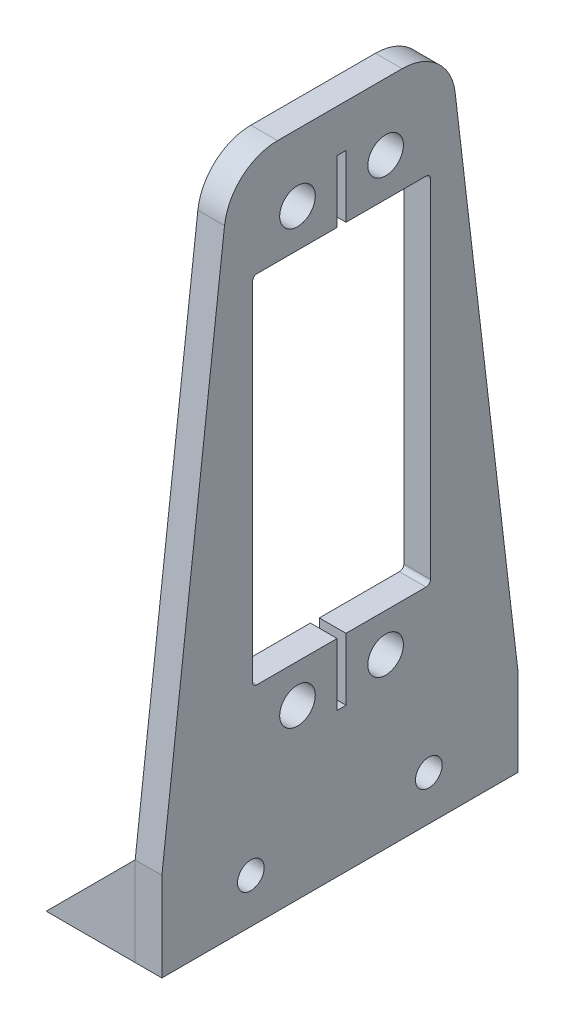
ISO-10303-21;
HEADER;
FILE_DESCRIPTION(('STEP AP214'),'2;1');
FILE_NAME('part.step','',(''),(''),'','','');
FILE_SCHEMA(('AUTOMOTIVE_DESIGN { 1 0 10303 214 1 1 1 1 }'));
ENDSEC;
DATA;
#1=APPLICATION_CONTEXT('core data for automotive mechanical design processes');
#2=APPLICATION_PROTOCOL_DEFINITION('international standard','automotive_design',2000,#1);
#3=PRODUCT_CONTEXT('',#1,'mechanical');
#4=PRODUCT('Part','Part','',(#3));
#5=PRODUCT_RELATED_PRODUCT_CATEGORY('part','',(#4));
#6=PRODUCT_DEFINITION_FORMATION('','',#4);
#7=PRODUCT_DEFINITION_CONTEXT('part definition',#1,'design');
#8=PRODUCT_DEFINITION('design','',#6,#7);
#9=PRODUCT_DEFINITION_SHAPE('','',#8);
#10=(LENGTH_UNIT() NAMED_UNIT(*) SI_UNIT(.MILLI.,.METRE.));
#11=(NAMED_UNIT(*) PLANE_ANGLE_UNIT() SI_UNIT($,.RADIAN.));
#12=(NAMED_UNIT(*) SI_UNIT($,.STERADIAN.) SOLID_ANGLE_UNIT());
#13=UNCERTAINTY_MEASURE_WITH_UNIT(LENGTH_MEASURE(1.E-05),#10,'distance_accuracy_value','');
#14=(GEOMETRIC_REPRESENTATION_CONTEXT(3) GLOBAL_UNCERTAINTY_ASSIGNED_CONTEXT((#13)) GLOBAL_UNIT_ASSIGNED_CONTEXT((#10,
#11,#12)) REPRESENTATION_CONTEXT('',''));
#15=CARTESIAN_POINT('',(0.,0.,0.));
#16=DIRECTION('',(0.,0.,1.));
#17=DIRECTION('',(1.,0.,0.));
#18=AXIS2_PLACEMENT_3D('',#15,#16,#17);
#19=CARTESIAN_POINT('',(23.,0.,20.));
#20=DIRECTION('',(0.,1.,0.));
#21=DIRECTION('',(0.,0.,1.));
#22=AXIS2_PLACEMENT_3D('',#19,#20,#21);
#23=PLANE('',#22);
#24=DIRECTION('',(0.,0.,-1.));
#25=VECTOR('',#24,1.);
#26=CARTESIAN_POINT('',(20.,0.,20.));
#27=LINE('',#26,#25);
#28=CARTESIAN_POINT('',(20.,0.,20.));
#29=VERTEX_POINT('',#28);
#30=CARTESIAN_POINT('',(20.,0.,-20.));
#31=VERTEX_POINT('',#30);
#32=EDGE_CURVE('E298',#29,#31,#27,.T.);
#33=ORIENTED_EDGE('',*,*,#32,.T.);
#34=DIRECTION('',(-1.,0.,0.));
#35=VECTOR('',#34,1.);
#36=CARTESIAN_POINT('',(23.,0.,-20.));
#37=LINE('',#36,#35);
#38=CARTESIAN_POINT('',(23.,0.,-20.));
#39=VERTEX_POINT('',#38);
#40=EDGE_CURVE('E12',#39,#31,#37,.T.);
#41=ORIENTED_EDGE('',*,*,#40,.F.);
#42=DIRECTION('',(0.,0.,-1.));
#43=VECTOR('',#42,1.);
#44=CARTESIAN_POINT('',(23.,0.,20.));
#45=LINE('',#44,#43);
#46=CARTESIAN_POINT('',(23.,0.,20.));
#47=VERTEX_POINT('',#46);
#48=EDGE_CURVE('E299',#47,#39,#45,.T.);
#49=ORIENTED_EDGE('',*,*,#48,.F.);
#50=DIRECTION('',(-1.,0.,0.));
#51=VECTOR('',#50,1.);
#52=CARTESIAN_POINT('',(23.,0.,20.));
#53=LINE('',#52,#51);
#54=EDGE_CURVE('E317',#47,#29,#53,.T.);
#55=ORIENTED_EDGE('',*,*,#54,.T.);
#56=EDGE_LOOP('',(#33,#41,#49,#55));
#57=FACE_BOUND('',#56,.T.);
#58=ADVANCED_FACE('F51',(#57),#23,.F.);
#59=CARTESIAN_POINT('',(23.,0.,-20.));
#60=DIRECTION('',(0.,0.,1.));
#61=DIRECTION('',(1.,0.,0.));
#62=AXIS2_PLACEMENT_3D('',#59,#60,#61);
#63=PLANE('',#62);
#64=DIRECTION('',(0.,1.,0.));
#65=VECTOR('',#64,1.);
#66=CARTESIAN_POINT('',(20.,0.,-20.));
#67=LINE('',#66,#65);
#68=CARTESIAN_POINT('',(20.,10.,-20.));
#69=VERTEX_POINT('',#68);
#70=EDGE_CURVE('E320',#31,#69,#67,.T.);
#71=ORIENTED_EDGE('',*,*,#70,.T.);
#72=DIRECTION('',(-1.,0.,0.));
#73=VECTOR('',#72,1.);
#74=CARTESIAN_POINT('',(23.,10.,-20.));
#75=LINE('',#74,#73);
#76=CARTESIAN_POINT('',(23.,10.,-20.));
#77=VERTEX_POINT('',#76);
#78=EDGE_CURVE('E58',#77,#69,#75,.T.);
#79=ORIENTED_EDGE('',*,*,#78,.F.);
#80=DIRECTION('',(0.,1.,0.));
#81=VECTOR('',#80,1.);
#82=CARTESIAN_POINT('',(23.,0.,-20.));
#83=LINE('',#82,#81);
#84=EDGE_CURVE('E302',#39,#77,#83,.T.);
#85=ORIENTED_EDGE('',*,*,#84,.F.);
#86=ORIENTED_EDGE('',*,*,#40,.T.);
#87=EDGE_LOOP('',(#71,#79,#85,#86));
#88=FACE_BOUND('',#87,.T.);
#89=ADVANCED_FACE('F376',(#88),#63,.F.);
#90=CARTESIAN_POINT('',(23.,10.,-20.));
#91=DIRECTION('',(0.,-0.117127450682147,0.993116891557435));
#92=DIRECTION('',(0.,-0.993116891557435,-0.117127450682147));
#93=AXIS2_PLACEMENT_3D('',#90,#91,#92);
#94=PLANE('',#93);
#95=DIRECTION('',(0.,0.993116891557435,0.117127450682147));
#96=VECTOR('',#95,1.);
#97=CARTESIAN_POINT('',(20.,10.,-20.));
#98=LINE('',#97,#96);
#99=CARTESIAN_POINT('',(20.,69.7027647040929,-12.9587013493446));
#100=VERTEX_POINT('',#99);
#101=EDGE_CURVE('E322',#69,#100,#98,.T.);
#102=ORIENTED_EDGE('',*,*,#101,.T.);
#103=DIRECTION('',(-1.,0.,0.));
#104=VECTOR('',#103,1.);
#105=CARTESIAN_POINT('',(23.,69.7027647040929,-12.9587013493446));
#106=LINE('',#105,#104);
#107=CARTESIAN_POINT('',(23.,69.7027647040929,-12.9587013493446));
#108=VERTEX_POINT('',#107);
#109=EDGE_CURVE('E347',#108,#100,#106,.T.);
#110=ORIENTED_EDGE('',*,*,#109,.F.);
#111=DIRECTION('',(0.,0.993116891557435,0.117127450682147));
#112=VECTOR('',#111,1.);
#113=CARTESIAN_POINT('',(23.,10.,-20.));
#114=LINE('',#113,#112);
#115=EDGE_CURVE('E305',#77,#108,#114,.T.);
#116=ORIENTED_EDGE('',*,*,#115,.F.);
#117=ORIENTED_EDGE('',*,*,#78,.T.);
#118=EDGE_LOOP('',(#102,#110,#116,#117));
#119=FACE_BOUND('',#118,.T.);
#120=ADVANCED_FACE('F354',(#119),#94,.F.);
#121=CARTESIAN_POINT('',(23.,69.,-7.));
#122=DIRECTION('',(-1.,0.,0.));
#123=DIRECTION('',(0.,0.,1.));
#124=AXIS2_PLACEMENT_3D('',#121,#122,#123);
#125=CYLINDRICAL_SURFACE('',#124,6.);
#126=CARTESIAN_POINT('',(20.,69.,-7.));
#127=DIRECTION('',(1.,0.,0.));
#128=DIRECTION('',(0.,0.,-1.));
#129=AXIS2_PLACEMENT_3D('',#126,#127,#128);
#130=CIRCLE('',#129,6.);
#131=CARTESIAN_POINT('',(20.,75.,-7.));
#132=VERTEX_POINT('',#131);
#133=EDGE_CURVE('E324',#100,#132,#130,.T.);
#134=ORIENTED_EDGE('',*,*,#133,.T.);
#135=DIRECTION('',(-1.,0.,0.));
#136=VECTOR('',#135,1.);
#137=CARTESIAN_POINT('',(23.,75.,-7.));
#138=LINE('',#137,#136);
#139=CARTESIAN_POINT('',(23.,75.,-7.));
#140=VERTEX_POINT('',#139);
#141=EDGE_CURVE('E344',#140,#132,#138,.T.);
#142=ORIENTED_EDGE('',*,*,#141,.F.);
#143=CARTESIAN_POINT('',(23.,69.,-7.));
#144=DIRECTION('',(1.,0.,0.));
#145=DIRECTION('',(0.,0.,-1.));
#146=AXIS2_PLACEMENT_3D('',#143,#144,#145);
#147=CIRCLE('',#146,6.);
#148=EDGE_CURVE('E307',#108,#140,#147,.T.);
#149=ORIENTED_EDGE('',*,*,#148,.F.);
#150=ORIENTED_EDGE('',*,*,#109,.T.);
#151=EDGE_LOOP('',(#134,#142,#149,#150));
#152=FACE_BOUND('',#151,.T.);
#153=ADVANCED_FACE('F364',(#152),#125,.T.);
#154=CARTESIAN_POINT('',(23.,75.,-7.));
#155=DIRECTION('',(0.,-1.,0.));
#156=DIRECTION('',(0.,0.,-1.));
#157=AXIS2_PLACEMENT_3D('',#154,#155,#156);
#158=PLANE('',#157);
#159=DIRECTION('',(0.,0.,1.));
#160=VECTOR('',#159,1.);
#161=CARTESIAN_POINT('',(20.,75.,-7.));
#162=LINE('',#161,#160);
#163=CARTESIAN_POINT('',(20.,75.,7.));
#164=VERTEX_POINT('',#163);
#165=EDGE_CURVE('E326',#132,#164,#162,.T.);
#166=ORIENTED_EDGE('',*,*,#165,.T.);
#167=DIRECTION('',(-1.,0.,0.));
#168=VECTOR('',#167,1.);
#169=CARTESIAN_POINT('',(23.,75.,7.));
#170=LINE('',#169,#168);
#171=CARTESIAN_POINT('',(23.,75.,7.));
#172=VERTEX_POINT('',#171);
#173=EDGE_CURVE('E341',#172,#164,#170,.T.);
#174=ORIENTED_EDGE('',*,*,#173,.F.);
#175=DIRECTION('',(0.,0.,1.));
#176=VECTOR('',#175,1.);
#177=CARTESIAN_POINT('',(23.,75.,-7.));
#178=LINE('',#177,#176);
#179=EDGE_CURVE('E309',#140,#172,#178,.T.);
#180=ORIENTED_EDGE('',*,*,#179,.F.);
#181=ORIENTED_EDGE('',*,*,#141,.T.);
#182=EDGE_LOOP('',(#166,#174,#180,#181));
#183=FACE_BOUND('',#182,.T.);
#184=ADVANCED_FACE('F368',(#183),#158,.F.);
#185=CARTESIAN_POINT('',(23.,69.,7.));
#186=DIRECTION('',(-1.,0.,0.));
#187=DIRECTION('',(0.,0.,1.));
#188=AXIS2_PLACEMENT_3D('',#185,#186,#187);
#189=CYLINDRICAL_SURFACE('',#188,6.);
#190=CARTESIAN_POINT('',(20.,69.,7.));
#191=DIRECTION('',(1.,0.,0.));
#192=DIRECTION('',(0.,0.,1.));
#193=AXIS2_PLACEMENT_3D('',#190,#191,#192);
#194=CIRCLE('',#193,6.);
#195=CARTESIAN_POINT('',(20.,69.7027647040929,12.9587013493446));
#196=VERTEX_POINT('',#195);
#197=EDGE_CURVE('E328',#164,#196,#194,.T.);
#198=ORIENTED_EDGE('',*,*,#197,.T.);
#199=DIRECTION('',(-1.,0.,0.));
#200=VECTOR('',#199,1.);
#201=CARTESIAN_POINT('',(23.,69.7027647040929,12.9587013493446));
#202=LINE('',#201,#200);
#203=CARTESIAN_POINT('',(23.,69.7027647040929,12.9587013493446));
#204=VERTEX_POINT('',#203);
#205=EDGE_CURVE('E338',#204,#196,#202,.T.);
#206=ORIENTED_EDGE('',*,*,#205,.F.);
#207=CARTESIAN_POINT('',(23.,69.,7.));
#208=DIRECTION('',(1.,0.,0.));
#209=DIRECTION('',(0.,0.,1.));
#210=AXIS2_PLACEMENT_3D('',#207,#208,#209);
#211=CIRCLE('',#210,6.);
#212=EDGE_CURVE('E311',#172,#204,#211,.T.);
#213=ORIENTED_EDGE('',*,*,#212,.F.);
#214=ORIENTED_EDGE('',*,*,#173,.T.);
#215=EDGE_LOOP('',(#198,#206,#213,#214));
#216=FACE_BOUND('',#215,.T.);
#217=ADVANCED_FACE('F389',(#216),#189,.T.);
#218=CARTESIAN_POINT('',(23.,10.,20.));
#219=DIRECTION('',(0.,-0.117127450682147,-0.993116891557435));
#220=DIRECTION('',(0.,0.993116891557435,-0.117127450682147));
#221=AXIS2_PLACEMENT_3D('',#218,#219,#220);
#222=PLANE('',#221);
#223=DIRECTION('',(0.,-0.993116891557435,0.117127450682147));
#224=VECTOR('',#223,1.);
#225=CARTESIAN_POINT('',(20.,10.,20.));
#226=LINE('',#225,#224);
#227=CARTESIAN_POINT('',(20.,10.,20.));
#228=VERTEX_POINT('',#227);
#229=EDGE_CURVE('E330',#196,#228,#226,.T.);
#230=ORIENTED_EDGE('',*,*,#229,.T.);
#231=DIRECTION('',(-1.,0.,0.));
#232=VECTOR('',#231,1.);
#233=CARTESIAN_POINT('',(23.,10.,20.));
#234=LINE('',#233,#232);
#235=CARTESIAN_POINT('',(23.,10.,20.));
#236=VERTEX_POINT('',#235);
#237=EDGE_CURVE('E335',#236,#228,#234,.T.);
#238=ORIENTED_EDGE('',*,*,#237,.F.);
#239=DIRECTION('',(0.,-0.993116891557435,0.117127450682147));
#240=VECTOR('',#239,1.);
#241=CARTESIAN_POINT('',(23.,10.,20.));
#242=LINE('',#241,#240);
#243=EDGE_CURVE('E313',#204,#236,#242,.T.);
#244=ORIENTED_EDGE('',*,*,#243,.F.);
#245=ORIENTED_EDGE('',*,*,#205,.T.);
#246=EDGE_LOOP('',(#230,#238,#244,#245));
#247=FACE_BOUND('',#246,.T.);
#248=ADVANCED_FACE('F387',(#247),#222,.F.);
#249=CARTESIAN_POINT('',(23.,10.,20.));
#250=DIRECTION('',(0.,0.,-1.));
#251=DIRECTION('',(-1.,0.,0.));
#252=AXIS2_PLACEMENT_3D('',#249,#250,#251);
#253=PLANE('',#252);
#254=DIRECTION('',(0.,-1.,0.));
#255=VECTOR('',#254,1.);
#256=CARTESIAN_POINT('',(20.,10.,20.));
#257=LINE('',#256,#255);
#258=EDGE_CURVE('E303',#228,#29,#257,.T.);
#259=ORIENTED_EDGE('',*,*,#258,.T.);
#260=ORIENTED_EDGE('',*,*,#54,.F.);
#261=DIRECTION('',(0.,-1.,0.));
#262=VECTOR('',#261,1.);
#263=CARTESIAN_POINT('',(23.,10.,20.));
#264=LINE('',#263,#262);
#265=EDGE_CURVE('E315',#236,#47,#264,.T.);
#266=ORIENTED_EDGE('',*,*,#265,.F.);
#267=ORIENTED_EDGE('',*,*,#237,.T.);
#268=EDGE_LOOP('',(#259,#260,#266,#267));
#269=FACE_BOUND('',#268,.T.);
#270=ADVANCED_FACE('F382',(#269),#253,.F.);
#271=CARTESIAN_POINT('',(23.,69.,-7.));
#272=DIRECTION('',(1.,0.,0.));
#273=DIRECTION('',(0.,0.,-1.));
#274=AXIS2_PLACEMENT_3D('',#271,#272,#273);
#275=PLANE('',#274);
#276=CARTESIAN_POINT('',(23.,5.,-10.));
#277=DIRECTION('',(1.,0.,0.));
#278=DIRECTION('',(0.,0.,-1.));
#279=AXIS2_PLACEMENT_3D('',#276,#277,#278);
#280=CIRCLE('',#279,1.5);
#281=CARTESIAN_POINT('',(23.,5.,-11.5));
#282=VERTEX_POINT('',#281);
#283=EDGE_CURVE('E764',#282,#282,#280,.T.);
#284=ORIENTED_EDGE('',*,*,#283,.F.);
#285=EDGE_LOOP('',(#284));
#286=FACE_BOUND('',#285,.T.);
#287=CARTESIAN_POINT('',(23.,4.99999999999999,10.));
#288=DIRECTION('',(1.,0.,0.));
#289=DIRECTION('',(0.,0.,-1.));
#290=AXIS2_PLACEMENT_3D('',#287,#288,#289);
#291=CIRCLE('',#290,1.5);
#292=CARTESIAN_POINT('',(23.,4.99999999999999,8.5));
#293=VERTEX_POINT('',#292);
#294=EDGE_CURVE('E770',#293,#293,#291,.T.);
#295=ORIENTED_EDGE('',*,*,#294,.F.);
#296=EDGE_LOOP('',(#295));
#297=FACE_BOUND('',#296,.T.);
#298=CARTESIAN_POINT('',(23.,67.5,4.75849529097955));
#299=DIRECTION('',(1.,0.,0.));
#300=DIRECTION('',(0.,0.,-1.));
#301=AXIS2_PLACEMENT_3D('',#298,#299,#300);
#302=CIRCLE('',#301,2.);
#303=CARTESIAN_POINT('',(23.,67.5,2.75849529097955));
#304=VERTEX_POINT('',#303);
#305=EDGE_CURVE('E284',#304,#304,#302,.T.);
#306=ORIENTED_EDGE('',*,*,#305,.F.);
#307=EDGE_LOOP('',(#306));
#308=FACE_BOUND('',#307,.T.);
#309=CARTESIAN_POINT('',(23.,18.9,-5.14150470902062));
#310=DIRECTION('',(1.,0.,0.));
#311=DIRECTION('',(0.,0.,-1.));
#312=AXIS2_PLACEMENT_3D('',#309,#310,#311);
#313=CIRCLE('',#312,2.);
#314=CARTESIAN_POINT('',(23.,18.9,-7.14150470902062));
#315=VERTEX_POINT('',#314);
#316=EDGE_CURVE('E285',#315,#315,#313,.T.);
#317=ORIENTED_EDGE('',*,*,#316,.F.);
#318=EDGE_LOOP('',(#317));
#319=FACE_BOUND('',#318,.T.);
#320=DIRECTION('',(0.,0.,-1.));
#321=VECTOR('',#320,1.);
#322=CARTESIAN_POINT('',(23.,23.2,9.05849529097939));
#323=LINE('',#322,#321);
#324=CARTESIAN_POINT('',(23.,23.2,9.3084952909794));
#325=VERTEX_POINT('',#324);
#326=CARTESIAN_POINT('',(23.,23.2,0.308495290979401));
#327=VERTEX_POINT('',#326);
#328=EDGE_CURVE('E65',#325,#327,#323,.T.);
#329=ORIENTED_EDGE('',*,*,#328,.F.);
#330=CARTESIAN_POINT('',(23.,23.7,9.3084952909794));
#331=DIRECTION('',(1.,0.,0.));
#332=DIRECTION('',(0.,0.,-1.));
#333=AXIS2_PLACEMENT_3D('',#330,#331,#332);
#334=CIRCLE('',#333,0.5);
#335=CARTESIAN_POINT('',(23.,23.7,9.8084952909794));
#336=VERTEX_POINT('',#335);
#337=EDGE_CURVE('E218',#336,#325,#334,.T.);
#338=ORIENTED_EDGE('',*,*,#337,.F.);
#339=DIRECTION('',(0.,-1.,0.));
#340=VECTOR('',#339,1.);
#341=CARTESIAN_POINT('',(23.,23.7,9.8084952909794));
#342=LINE('',#341,#340);
#343=CARTESIAN_POINT('',(23.,62.7,9.80849529097953));
#344=VERTEX_POINT('',#343);
#345=EDGE_CURVE('E808',#344,#336,#342,.T.);
#346=ORIENTED_EDGE('',*,*,#345,.F.);
#347=CARTESIAN_POINT('',(23.,62.7,9.30849529097953));
#348=DIRECTION('',(1.,0.,0.));
#349=DIRECTION('',(0.,0.,-1.));
#350=AXIS2_PLACEMENT_3D('',#347,#348,#349);
#351=CIRCLE('',#350,0.5);
#352=CARTESIAN_POINT('',(23.,63.2,9.30849529097953));
#353=VERTEX_POINT('',#352);
#354=EDGE_CURVE('E811',#353,#344,#351,.T.);
#355=ORIENTED_EDGE('',*,*,#354,.F.);
#356=DIRECTION('',(0.,0.,1.));
#357=VECTOR('',#356,1.);
#358=CARTESIAN_POINT('',(23.,63.2,9.30849529097953));
#359=LINE('',#358,#357);
#360=CARTESIAN_POINT('',(23.,63.2,0.308495290979533));
#361=VERTEX_POINT('',#360);
#362=EDGE_CURVE('E814',#361,#353,#359,.T.);
#363=ORIENTED_EDGE('',*,*,#362,.F.);
#364=DIRECTION('',(0.,-1.,0.));
#365=VECTOR('',#364,1.);
#366=CARTESIAN_POINT('',(23.,70.2,0.308495290979557));
#367=LINE('',#366,#365);
#368=CARTESIAN_POINT('',(23.,70.2,0.308495290979557));
#369=VERTEX_POINT('',#368);
#370=EDGE_CURVE('E817',#369,#361,#367,.T.);
#371=ORIENTED_EDGE('',*,*,#370,.F.);
#372=DIRECTION('',(0.,0.,1.));
#373=VECTOR('',#372,1.);
#374=CARTESIAN_POINT('',(23.,70.2,-0.691504709020444));
#375=LINE('',#374,#373);
#376=CARTESIAN_POINT('',(23.,70.2,-0.691504709020444));
#377=VERTEX_POINT('',#376);
#378=EDGE_CURVE('E820',#377,#369,#375,.T.);
#379=ORIENTED_EDGE('',*,*,#378,.F.);
#380=DIRECTION('',(0.,1.,0.));
#381=VECTOR('',#380,1.);
#382=CARTESIAN_POINT('',(23.,63.2,-0.691504709020468));
#383=LINE('',#382,#381);
#384=CARTESIAN_POINT('',(23.,63.2,-0.691504709020468));
#385=VERTEX_POINT('',#384);
#386=EDGE_CURVE('E823',#385,#377,#383,.T.);
#387=ORIENTED_EDGE('',*,*,#386,.F.);
#388=DIRECTION('',(0.,0.,1.));
#389=VECTOR('',#388,1.);
#390=CARTESIAN_POINT('',(23.,63.2,-0.691504709020468));
#391=LINE('',#390,#389);
#392=CARTESIAN_POINT('',(23.,63.2,-9.69150470902047));
#393=VERTEX_POINT('',#392);
#394=EDGE_CURVE('E826',#393,#385,#391,.T.);
#395=ORIENTED_EDGE('',*,*,#394,.F.);
#396=CARTESIAN_POINT('',(23.,62.7,-9.69150470902047));
#397=DIRECTION('',(1.,0.,0.));
#398=DIRECTION('',(0.,0.,-1.));
#399=AXIS2_PLACEMENT_3D('',#396,#397,#398);
#400=CIRCLE('',#399,0.500000000000001);
#401=CARTESIAN_POINT('',(23.,62.7,-10.1915047090205));
#402=VERTEX_POINT('',#401);
#403=EDGE_CURVE('E829',#402,#393,#400,.T.);
#404=ORIENTED_EDGE('',*,*,#403,.F.);
#405=DIRECTION('',(0.,1.,0.));
#406=VECTOR('',#405,1.);
#407=CARTESIAN_POINT('',(23.,62.7,-10.1915047090205));
#408=LINE('',#407,#406);
#409=CARTESIAN_POINT('',(23.,23.7,-10.1915047090206));
#410=VERTEX_POINT('',#409);
#411=EDGE_CURVE('E832',#410,#402,#408,.T.);
#412=ORIENTED_EDGE('',*,*,#411,.F.);
#413=CARTESIAN_POINT('',(23.,23.7,-9.6915047090206));
#414=DIRECTION('',(1.,0.,0.));
#415=DIRECTION('',(0.,0.,-1.));
#416=AXIS2_PLACEMENT_3D('',#413,#414,#415);
#417=CIRCLE('',#416,0.5);
#418=CARTESIAN_POINT('',(23.,23.2,-9.6915047090206));
#419=VERTEX_POINT('',#418);
#420=EDGE_CURVE('E835',#419,#410,#417,.T.);
#421=ORIENTED_EDGE('',*,*,#420,.F.);
#422=DIRECTION('',(0.,0.,-1.));
#423=VECTOR('',#422,1.);
#424=CARTESIAN_POINT('',(23.,23.2,-9.6915047090206));
#425=LINE('',#424,#423);
#426=CARTESIAN_POINT('',(23.,23.2,-0.6915047090206));
#427=VERTEX_POINT('',#426);
#428=EDGE_CURVE('E838',#427,#419,#425,.T.);
#429=ORIENTED_EDGE('',*,*,#428,.F.);
#430=DIRECTION('',(0.,1.,0.));
#431=VECTOR('',#430,1.);
#432=CARTESIAN_POINT('',(23.,16.2,-0.691504709020624));
#433=LINE('',#432,#431);
#434=CARTESIAN_POINT('',(23.,16.2,-0.691504709020624));
#435=VERTEX_POINT('',#434);
#436=EDGE_CURVE('E841',#435,#427,#433,.T.);
#437=ORIENTED_EDGE('',*,*,#436,.F.);
#438=DIRECTION('',(0.,0.,-1.));
#439=VECTOR('',#438,1.);
#440=CARTESIAN_POINT('',(23.,16.2,0.308495290979377));
#441=LINE('',#440,#439);
#442=CARTESIAN_POINT('',(23.,16.2,0.308495290979377));
#443=VERTEX_POINT('',#442);
#444=EDGE_CURVE('E844',#443,#435,#441,.T.);
#445=ORIENTED_EDGE('',*,*,#444,.F.);
#446=DIRECTION('',(0.,-1.,0.));
#447=VECTOR('',#446,1.);
#448=CARTESIAN_POINT('',(23.,23.2,0.308495290979401));
#449=LINE('',#448,#447);
#450=EDGE_CURVE('E229',#327,#443,#449,.T.);
#451=ORIENTED_EDGE('',*,*,#450,.F.);
#452=EDGE_LOOP('',(#329,#338,#346,#355,#363,#371,#379,#387,#395,#404,#412,#421,#429,#437,#445,#451));
#453=FACE_BOUND('',#452,.T.);
#454=CARTESIAN_POINT('',(23.,18.9,4.75849529097937));
#455=DIRECTION('',(1.,0.,0.));
#456=DIRECTION('',(0.,0.,-1.));
#457=AXIS2_PLACEMENT_3D('',#454,#455,#456);
#458=CIRCLE('',#457,2.);
#459=CARTESIAN_POINT('',(23.,18.9,2.75849529097938));
#460=VERTEX_POINT('',#459);
#461=EDGE_CURVE('E277',#460,#460,#458,.T.);
#462=ORIENTED_EDGE('',*,*,#461,.F.);
#463=EDGE_LOOP('',(#462));
#464=FACE_BOUND('',#463,.T.);
#465=CARTESIAN_POINT('',(23.,67.5,-5.14150470902045));
#466=DIRECTION('',(1.,0.,0.));
#467=DIRECTION('',(0.,0.,-1.));
#468=AXIS2_PLACEMENT_3D('',#465,#466,#467);
#469=CIRCLE('',#468,2.);
#470=CARTESIAN_POINT('',(23.,67.5,-7.14150470902045));
#471=VERTEX_POINT('',#470);
#472=EDGE_CURVE('E288',#471,#471,#469,.T.);
#473=ORIENTED_EDGE('',*,*,#472,.F.);
#474=EDGE_LOOP('',(#473));
#475=FACE_BOUND('',#474,.T.);
#476=ORIENTED_EDGE('',*,*,#48,.T.);
#477=ORIENTED_EDGE('',*,*,#84,.T.);
#478=ORIENTED_EDGE('',*,*,#115,.T.);
#479=ORIENTED_EDGE('',*,*,#148,.T.);
#480=ORIENTED_EDGE('',*,*,#179,.T.);
#481=ORIENTED_EDGE('',*,*,#212,.T.);
#482=ORIENTED_EDGE('',*,*,#243,.T.);
#483=ORIENTED_EDGE('',*,*,#265,.T.);
#484=EDGE_LOOP('',(#476,#477,#478,#479,#480,#481,#482,#483));
#485=FACE_BOUND('',#484,.T.);
#486=ADVANCED_FACE('F372',(#286,#297,#308,#319,#453,#464,#475,#485),#275,.T.);
#487=CARTESIAN_POINT('',(20.,69.,-7.));
#488=DIRECTION('',(1.,0.,0.));
#489=DIRECTION('',(0.,0.,-1.));
#490=AXIS2_PLACEMENT_3D('',#487,#488,#489);
#491=PLANE('',#490);
#492=CARTESIAN_POINT('',(20.,5.,-10.));
#493=DIRECTION('',(1.,0.,0.));
#494=DIRECTION('',(0.,0.,-1.));
#495=AXIS2_PLACEMENT_3D('',#492,#493,#494);
#496=CIRCLE('',#495,1.5);
#497=CARTESIAN_POINT('',(20.,5.,-11.5));
#498=VERTEX_POINT('',#497);
#499=EDGE_CURVE('E767',#498,#498,#496,.F.);
#500=ORIENTED_EDGE('',*,*,#499,.F.);
#501=EDGE_LOOP('',(#500));
#502=FACE_BOUND('',#501,.T.);
#503=CARTESIAN_POINT('',(20.,4.99999999999999,10.));
#504=DIRECTION('',(1.,0.,0.));
#505=DIRECTION('',(0.,0.,-1.));
#506=AXIS2_PLACEMENT_3D('',#503,#504,#505);
#507=CIRCLE('',#506,1.5);
#508=CARTESIAN_POINT('',(20.,4.99999999999999,8.5));
#509=VERTEX_POINT('',#508);
#510=EDGE_CURVE('E773',#509,#509,#507,.F.);
#511=ORIENTED_EDGE('',*,*,#510,.F.);
#512=EDGE_LOOP('',(#511));
#513=FACE_BOUND('',#512,.T.);
#514=CARTESIAN_POINT('',(20.,67.5,4.75849529097955));
#515=DIRECTION('',(1.,0.,0.));
#516=DIRECTION('',(0.,0.,-1.));
#517=AXIS2_PLACEMENT_3D('',#514,#515,#516);
#518=CIRCLE('',#517,2.);
#519=CARTESIAN_POINT('',(20.,67.5,2.75849529097955));
#520=VERTEX_POINT('',#519);
#521=EDGE_CURVE('E281',#520,#520,#518,.F.);
#522=ORIENTED_EDGE('',*,*,#521,.F.);
#523=EDGE_LOOP('',(#522));
#524=FACE_BOUND('',#523,.T.);
#525=CARTESIAN_POINT('',(20.,18.9,-5.14150470902062));
#526=DIRECTION('',(1.,0.,0.));
#527=DIRECTION('',(0.,0.,-1.));
#528=AXIS2_PLACEMENT_3D('',#525,#526,#527);
#529=CIRCLE('',#528,2.);
#530=CARTESIAN_POINT('',(20.,18.9,-7.14150470902062));
#531=VERTEX_POINT('',#530);
#532=EDGE_CURVE('E280',#531,#531,#529,.F.);
#533=ORIENTED_EDGE('',*,*,#532,.F.);
#534=EDGE_LOOP('',(#533));
#535=FACE_BOUND('',#534,.T.);
#536=CARTESIAN_POINT('',(20.,23.7,9.3084952909794));
#537=DIRECTION('',(1.,0.,0.));
#538=DIRECTION('',(0.,0.,-1.));
#539=AXIS2_PLACEMENT_3D('',#536,#537,#538);
#540=CIRCLE('',#539,0.5);
#541=CARTESIAN_POINT('',(20.,23.2,9.3084952909794));
#542=VERTEX_POINT('',#541);
#543=CARTESIAN_POINT('',(20.,23.7,9.8084952909794));
#544=VERTEX_POINT('',#543);
#545=EDGE_CURVE('E215',#542,#544,#540,.F.);
#546=ORIENTED_EDGE('',*,*,#545,.F.);
#547=DIRECTION('',(0.,0.,1.));
#548=VECTOR('',#547,1.);
#549=CARTESIAN_POINT('',(20.,23.2,9.05849529097939));
#550=LINE('',#549,#548);
#551=CARTESIAN_POINT('',(20.,23.2,0.308495290979401));
#552=VERTEX_POINT('',#551);
#553=EDGE_CURVE('E223',#552,#542,#550,.T.);
#554=ORIENTED_EDGE('',*,*,#553,.F.);
#555=DIRECTION('',(0.,1.,0.));
#556=VECTOR('',#555,1.);
#557=CARTESIAN_POINT('',(20.,23.2,0.308495290979401));
#558=LINE('',#557,#556);
#559=CARTESIAN_POINT('',(20.,16.2,0.308495290979377));
#560=VERTEX_POINT('',#559);
#561=EDGE_CURVE('E220',#560,#552,#558,.T.);
#562=ORIENTED_EDGE('',*,*,#561,.F.);
#563=DIRECTION('',(0.,0.,1.));
#564=VECTOR('',#563,1.);
#565=CARTESIAN_POINT('',(20.,16.2,0.308495290979377));
#566=LINE('',#565,#564);
#567=CARTESIAN_POINT('',(20.,16.2,-0.691504709020624));
#568=VERTEX_POINT('',#567);
#569=EDGE_CURVE('E73',#568,#560,#566,.T.);
#570=ORIENTED_EDGE('',*,*,#569,.F.);
#571=DIRECTION('',(0.,-1.,0.));
#572=VECTOR('',#571,1.);
#573=CARTESIAN_POINT('',(20.,16.2,-0.691504709020624));
#574=LINE('',#573,#572);
#575=CARTESIAN_POINT('',(20.,23.2,-0.6915047090206));
#576=VERTEX_POINT('',#575);
#577=EDGE_CURVE('E270',#576,#568,#574,.T.);
#578=ORIENTED_EDGE('',*,*,#577,.F.);
#579=DIRECTION('',(0.,0.,1.));
#580=VECTOR('',#579,1.);
#581=CARTESIAN_POINT('',(20.,23.2,-9.6915047090206));
#582=LINE('',#581,#580);
#583=CARTESIAN_POINT('',(20.,23.2,-9.6915047090206));
#584=VERTEX_POINT('',#583);
#585=EDGE_CURVE('E267',#584,#576,#582,.T.);
#586=ORIENTED_EDGE('',*,*,#585,.F.);
#587=CARTESIAN_POINT('',(20.,23.7,-9.6915047090206));
#588=DIRECTION('',(1.,0.,0.));
#589=DIRECTION('',(0.,0.,-1.));
#590=AXIS2_PLACEMENT_3D('',#587,#588,#589);
#591=CIRCLE('',#590,0.5);
#592=CARTESIAN_POINT('',(20.,23.7,-10.1915047090206));
#593=VERTEX_POINT('',#592);
#594=EDGE_CURVE('E264',#593,#584,#591,.F.);
#595=ORIENTED_EDGE('',*,*,#594,.F.);
#596=DIRECTION('',(0.,-1.,0.));
#597=VECTOR('',#596,1.);
#598=CARTESIAN_POINT('',(20.,62.7,-10.1915047090205));
#599=LINE('',#598,#597);
#600=CARTESIAN_POINT('',(20.,62.7,-10.1915047090205));
#601=VERTEX_POINT('',#600);
#602=EDGE_CURVE('E261',#601,#593,#599,.T.);
#603=ORIENTED_EDGE('',*,*,#602,.F.);
#604=CARTESIAN_POINT('',(20.,62.7,-9.69150470902047));
#605=DIRECTION('',(1.,0.,0.));
#606=DIRECTION('',(0.,0.,-1.));
#607=AXIS2_PLACEMENT_3D('',#604,#605,#606);
#608=CIRCLE('',#607,0.500000000000001);
#609=CARTESIAN_POINT('',(20.,63.2,-9.69150470902047));
#610=VERTEX_POINT('',#609);
#611=EDGE_CURVE('E258',#610,#601,#608,.F.);
#612=ORIENTED_EDGE('',*,*,#611,.F.);
#613=DIRECTION('',(0.,0.,-1.));
#614=VECTOR('',#613,1.);
#615=CARTESIAN_POINT('',(20.,63.2,-0.691504709020468));
#616=LINE('',#615,#614);
#617=CARTESIAN_POINT('',(20.,63.2,-0.691504709020468));
#618=VERTEX_POINT('',#617);
#619=EDGE_CURVE('E255',#618,#610,#616,.T.);
#620=ORIENTED_EDGE('',*,*,#619,.F.);
#621=DIRECTION('',(0.,-1.,0.));
#622=VECTOR('',#621,1.);
#623=CARTESIAN_POINT('',(20.,63.2,-0.691504709020468));
#624=LINE('',#623,#622);
#625=CARTESIAN_POINT('',(20.,70.2,-0.691504709020444));
#626=VERTEX_POINT('',#625);
#627=EDGE_CURVE('E252',#626,#618,#624,.T.);
#628=ORIENTED_EDGE('',*,*,#627,.F.);
#629=DIRECTION('',(0.,0.,-1.));
#630=VECTOR('',#629,1.);
#631=CARTESIAN_POINT('',(20.,70.2,-0.691504709020444));
#632=LINE('',#631,#630);
#633=CARTESIAN_POINT('',(20.,70.2,0.308495290979557));
#634=VERTEX_POINT('',#633);
#635=EDGE_CURVE('E249',#634,#626,#632,.T.);
#636=ORIENTED_EDGE('',*,*,#635,.F.);
#637=DIRECTION('',(0.,1.,0.));
#638=VECTOR('',#637,1.);
#639=CARTESIAN_POINT('',(20.,70.2,0.308495290979557));
#640=LINE('',#639,#638);
#641=CARTESIAN_POINT('',(20.,63.2,0.308495290979533));
#642=VERTEX_POINT('',#641);
#643=EDGE_CURVE('E246',#642,#634,#640,.T.);
#644=ORIENTED_EDGE('',*,*,#643,.F.);
#645=DIRECTION('',(0.,0.,-1.));
#646=VECTOR('',#645,1.);
#647=CARTESIAN_POINT('',(20.,63.2,9.30849529097953));
#648=LINE('',#647,#646);
#649=CARTESIAN_POINT('',(20.,63.2,9.30849529097953));
#650=VERTEX_POINT('',#649);
#651=EDGE_CURVE('E243',#650,#642,#648,.T.);
#652=ORIENTED_EDGE('',*,*,#651,.F.);
#653=CARTESIAN_POINT('',(20.,62.7,9.30849529097953));
#654=DIRECTION('',(1.,0.,0.));
#655=DIRECTION('',(0.,0.,-1.));
#656=AXIS2_PLACEMENT_3D('',#653,#654,#655);
#657=CIRCLE('',#656,0.5);
#658=CARTESIAN_POINT('',(20.,62.7,9.80849529097953));
#659=VERTEX_POINT('',#658);
#660=EDGE_CURVE('E237',#659,#650,#657,.F.);
#661=ORIENTED_EDGE('',*,*,#660,.F.);
#662=DIRECTION('',(0.,1.,0.));
#663=VECTOR('',#662,1.);
#664=CARTESIAN_POINT('',(20.,23.7,9.8084952909794));
#665=LINE('',#664,#663);
#666=EDGE_CURVE('E235',#544,#659,#665,.T.);
#667=ORIENTED_EDGE('',*,*,#666,.F.);
#668=EDGE_LOOP('',(#546,#554,#562,#570,#578,#586,#595,#603,#612,#620,#628,#636,#644,#652,#661,#667));
#669=FACE_BOUND('',#668,.T.);
#670=CARTESIAN_POINT('',(20.,18.9,4.75849529097937));
#671=DIRECTION('',(1.,0.,0.));
#672=DIRECTION('',(0.,0.,-1.));
#673=AXIS2_PLACEMENT_3D('',#670,#671,#672);
#674=CIRCLE('',#673,2.);
#675=CARTESIAN_POINT('',(20.,18.9,2.75849529097938));
#676=VERTEX_POINT('',#675);
#677=EDGE_CURVE('E274',#676,#676,#674,.F.);
#678=ORIENTED_EDGE('',*,*,#677,.F.);
#679=EDGE_LOOP('',(#678));
#680=FACE_BOUND('',#679,.T.);
#681=CARTESIAN_POINT('',(20.,67.5,-5.14150470902045));
#682=DIRECTION('',(1.,0.,0.));
#683=DIRECTION('',(0.,0.,-1.));
#684=AXIS2_PLACEMENT_3D('',#681,#682,#683);
#685=CIRCLE('',#684,2.);
#686=CARTESIAN_POINT('',(20.,67.5,-7.14150470902045));
#687=VERTEX_POINT('',#686);
#688=EDGE_CURVE('E295',#687,#687,#685,.F.);
#689=ORIENTED_EDGE('',*,*,#688,.F.);
#690=EDGE_LOOP('',(#689));
#691=FACE_BOUND('',#690,.T.);
#692=ORIENTED_EDGE('',*,*,#32,.F.);
#693=ORIENTED_EDGE('',*,*,#258,.F.);
#694=ORIENTED_EDGE('',*,*,#229,.F.);
#695=ORIENTED_EDGE('',*,*,#197,.F.);
#696=ORIENTED_EDGE('',*,*,#165,.F.);
#697=ORIENTED_EDGE('',*,*,#133,.F.);
#698=ORIENTED_EDGE('',*,*,#101,.F.);
#699=ORIENTED_EDGE('',*,*,#70,.F.);
#700=EDGE_LOOP('',(#692,#693,#694,#695,#696,#697,#698,#699));
#701=FACE_BOUND('',#700,.T.);
#702=ADVANCED_FACE('F231',(#502,#513,#524,#535,#669,#680,#691,#701),#491,.F.);
#703=CARTESIAN_POINT('',(9.9989999999999,67.5,-5.14150470902045));
#704=DIRECTION('',(1.,0.,0.));
#705=DIRECTION('',(0.,0.,-1.));
#706=AXIS2_PLACEMENT_3D('',#703,#704,#705);
#707=CYLINDRICAL_SURFACE('',#706,2.);
#708=ORIENTED_EDGE('',*,*,#472,.T.);
#709=EDGE_LOOP('',(#708));
#710=FACE_BOUND('',#709,.T.);
#711=ORIENTED_EDGE('',*,*,#688,.T.);
#712=EDGE_LOOP('',(#711));
#713=FACE_BOUND('',#712,.T.);
#714=ADVANCED_FACE('F445',(#710,#713),#707,.F.);
#715=CARTESIAN_POINT('',(9.9989999999999,18.9,4.75849529097937));
#716=DIRECTION('',(1.,0.,0.));
#717=DIRECTION('',(0.,0.,-1.));
#718=AXIS2_PLACEMENT_3D('',#715,#716,#717);
#719=CYLINDRICAL_SURFACE('',#718,2.);
#720=ORIENTED_EDGE('',*,*,#461,.T.);
#721=EDGE_LOOP('',(#720));
#722=FACE_BOUND('',#721,.T.);
#723=ORIENTED_EDGE('',*,*,#677,.T.);
#724=EDGE_LOOP('',(#723));
#725=FACE_BOUND('',#724,.T.);
#726=ADVANCED_FACE('F450',(#722,#725),#719,.F.);
#727=CARTESIAN_POINT('',(9.9989999999999,23.2,9.05849529097939));
#728=DIRECTION('',(0.,-1.,0.));
#729=DIRECTION('',(0.,0.,-1.));
#730=AXIS2_PLACEMENT_3D('',#727,#728,#729);
#731=PLANE('',#730);
#732=ORIENTED_EDGE('',*,*,#553,.T.);
#733=DIRECTION('',(1.,0.,0.));
#734=VECTOR('',#733,1.);
#735=CARTESIAN_POINT('',(9.9989999999999,23.2,9.3084952909794));
#736=LINE('',#735,#734);
#737=EDGE_CURVE('E211',#542,#325,#736,.T.);
#738=ORIENTED_EDGE('',*,*,#737,.T.);
#739=ORIENTED_EDGE('',*,*,#328,.T.);
#740=DIRECTION('',(1.,0.,0.));
#741=VECTOR('',#740,1.);
#742=CARTESIAN_POINT('',(9.9989999999999,23.2,0.308495290979401));
#743=LINE('',#742,#741);
#744=EDGE_CURVE('E225',#552,#327,#743,.T.);
#745=ORIENTED_EDGE('',*,*,#744,.F.);
#746=EDGE_LOOP('',(#732,#738,#739,#745));
#747=FACE_BOUND('',#746,.T.);
#748=ADVANCED_FACE('F224',(#747),#731,.F.);
#749=CARTESIAN_POINT('',(9.9989999999999,23.7,9.3084952909794));
#750=DIRECTION('',(1.,0.,0.));
#751=DIRECTION('',(0.,0.,-1.));
#752=AXIS2_PLACEMENT_3D('',#749,#750,#751);
#753=CYLINDRICAL_SURFACE('',#752,0.5);
#754=ORIENTED_EDGE('',*,*,#545,.T.);
#755=DIRECTION('',(1.,0.,0.));
#756=VECTOR('',#755,1.);
#757=CARTESIAN_POINT('',(9.9989999999999,23.7,9.8084952909794));
#758=LINE('',#757,#756);
#759=EDGE_CURVE('E219',#544,#336,#758,.T.);
#760=ORIENTED_EDGE('',*,*,#759,.T.);
#761=ORIENTED_EDGE('',*,*,#337,.T.);
#762=ORIENTED_EDGE('',*,*,#737,.F.);
#763=EDGE_LOOP('',(#754,#760,#761,#762));
#764=FACE_BOUND('',#763,.T.);
#765=ADVANCED_FACE('F213',(#764),#753,.F.);
#766=CARTESIAN_POINT('',(9.9989999999999,23.7,9.8084952909794));
#767=DIRECTION('',(0.,0.,1.));
#768=DIRECTION('',(0.,-1.,0.));
#769=AXIS2_PLACEMENT_3D('',#766,#767,#768);
#770=PLANE('',#769);
#771=ORIENTED_EDGE('',*,*,#666,.T.);
#772=DIRECTION('',(1.,0.,0.));
#773=VECTOR('',#772,1.);
#774=CARTESIAN_POINT('',(9.9989999999999,62.7,9.80849529097953));
#775=LINE('',#774,#773);
#776=EDGE_CURVE('E803',#659,#344,#775,.T.);
#777=ORIENTED_EDGE('',*,*,#776,.T.);
#778=ORIENTED_EDGE('',*,*,#345,.T.);
#779=ORIENTED_EDGE('',*,*,#759,.F.);
#780=EDGE_LOOP('',(#771,#777,#778,#779));
#781=FACE_BOUND('',#780,.T.);
#782=ADVANCED_FACE('F482',(#781),#770,.F.);
#783=CARTESIAN_POINT('',(9.9989999999999,62.7,9.30849529097953));
#784=DIRECTION('',(1.,0.,0.));
#785=DIRECTION('',(0.,0.,-1.));
#786=AXIS2_PLACEMENT_3D('',#783,#784,#785);
#787=CYLINDRICAL_SURFACE('',#786,0.5);
#788=ORIENTED_EDGE('',*,*,#660,.T.);
#789=DIRECTION('',(1.,0.,0.));
#790=VECTOR('',#789,1.);
#791=CARTESIAN_POINT('',(9.9989999999999,63.2,9.30849529097953));
#792=LINE('',#791,#790);
#793=EDGE_CURVE('E801',#650,#353,#792,.T.);
#794=ORIENTED_EDGE('',*,*,#793,.T.);
#795=ORIENTED_EDGE('',*,*,#354,.T.);
#796=ORIENTED_EDGE('',*,*,#776,.F.);
#797=EDGE_LOOP('',(#788,#794,#795,#796));
#798=FACE_BOUND('',#797,.T.);
#799=ADVANCED_FACE('F492',(#798),#787,.F.);
#800=CARTESIAN_POINT('',(9.9989999999999,63.2,9.30849529097953));
#801=DIRECTION('',(0.,1.,0.));
#802=DIRECTION('',(0.,0.,1.));
#803=AXIS2_PLACEMENT_3D('',#800,#801,#802);
#804=PLANE('',#803);
#805=ORIENTED_EDGE('',*,*,#651,.T.);
#806=DIRECTION('',(1.,0.,0.));
#807=VECTOR('',#806,1.);
#808=CARTESIAN_POINT('',(9.9989999999999,63.2,0.308495290979533));
#809=LINE('',#808,#807);
#810=EDGE_CURVE('E799',#642,#361,#809,.T.);
#811=ORIENTED_EDGE('',*,*,#810,.T.);
#812=ORIENTED_EDGE('',*,*,#362,.T.);
#813=ORIENTED_EDGE('',*,*,#793,.F.);
#814=EDGE_LOOP('',(#805,#811,#812,#813));
#815=FACE_BOUND('',#814,.T.);
#816=ADVANCED_FACE('F503',(#815),#804,.F.);
#817=CARTESIAN_POINT('',(9.9989999999999,70.2,0.308495290979557));
#818=DIRECTION('',(0.,0.,1.));
#819=DIRECTION('',(0.,-1.,0.));
#820=AXIS2_PLACEMENT_3D('',#817,#818,#819);
#821=PLANE('',#820);
#822=ORIENTED_EDGE('',*,*,#643,.T.);
#823=DIRECTION('',(1.,0.,0.));
#824=VECTOR('',#823,1.);
#825=CARTESIAN_POINT('',(9.9989999999999,70.2,0.308495290979557));
#826=LINE('',#825,#824);
#827=EDGE_CURVE('E797',#634,#369,#826,.T.);
#828=ORIENTED_EDGE('',*,*,#827,.T.);
#829=ORIENTED_EDGE('',*,*,#370,.T.);
#830=ORIENTED_EDGE('',*,*,#810,.F.);
#831=EDGE_LOOP('',(#822,#828,#829,#830));
#832=FACE_BOUND('',#831,.T.);
#833=ADVANCED_FACE('F515',(#832),#821,.F.);
#834=CARTESIAN_POINT('',(9.9989999999999,70.2,-0.691504709020444));
#835=DIRECTION('',(0.,1.,0.));
#836=DIRECTION('',(0.,0.,1.));
#837=AXIS2_PLACEMENT_3D('',#834,#835,#836);
#838=PLANE('',#837);
#839=ORIENTED_EDGE('',*,*,#635,.T.);
#840=DIRECTION('',(1.,0.,0.));
#841=VECTOR('',#840,1.);
#842=CARTESIAN_POINT('',(9.9989999999999,70.2,-0.691504709020444));
#843=LINE('',#842,#841);
#844=EDGE_CURVE('E795',#626,#377,#843,.T.);
#845=ORIENTED_EDGE('',*,*,#844,.T.);
#846=ORIENTED_EDGE('',*,*,#378,.T.);
#847=ORIENTED_EDGE('',*,*,#827,.F.);
#848=EDGE_LOOP('',(#839,#845,#846,#847));
#849=FACE_BOUND('',#848,.T.);
#850=ADVANCED_FACE('F525',(#849),#838,.F.);
#851=CARTESIAN_POINT('',(9.9989999999999,63.2,-0.691504709020468));
#852=DIRECTION('',(0.,0.,-1.));
#853=DIRECTION('',(0.,1.,0.));
#854=AXIS2_PLACEMENT_3D('',#851,#852,#853);
#855=PLANE('',#854);
#856=ORIENTED_EDGE('',*,*,#627,.T.);
#857=DIRECTION('',(1.,0.,0.));
#858=VECTOR('',#857,1.);
#859=CARTESIAN_POINT('',(9.9989999999999,63.2,-0.691504709020468));
#860=LINE('',#859,#858);
#861=EDGE_CURVE('E793',#618,#385,#860,.T.);
#862=ORIENTED_EDGE('',*,*,#861,.T.);
#863=ORIENTED_EDGE('',*,*,#386,.T.);
#864=ORIENTED_EDGE('',*,*,#844,.F.);
#865=EDGE_LOOP('',(#856,#862,#863,#864));
#866=FACE_BOUND('',#865,.T.);
#867=ADVANCED_FACE('F536',(#866),#855,.F.);
#868=CARTESIAN_POINT('',(9.9989999999999,63.2,-0.691504709020468));
#869=DIRECTION('',(0.,1.,0.));
#870=DIRECTION('',(0.,0.,1.));
#871=AXIS2_PLACEMENT_3D('',#868,#869,#870);
#872=PLANE('',#871);
#873=ORIENTED_EDGE('',*,*,#619,.T.);
#874=DIRECTION('',(1.,0.,0.));
#875=VECTOR('',#874,1.);
#876=CARTESIAN_POINT('',(9.9989999999999,63.2,-9.69150470902047));
#877=LINE('',#876,#875);
#878=EDGE_CURVE('E791',#610,#393,#877,.T.);
#879=ORIENTED_EDGE('',*,*,#878,.T.);
#880=ORIENTED_EDGE('',*,*,#394,.T.);
#881=ORIENTED_EDGE('',*,*,#861,.F.);
#882=EDGE_LOOP('',(#873,#879,#880,#881));
#883=FACE_BOUND('',#882,.T.);
#884=ADVANCED_FACE('F547',(#883),#872,.F.);
#885=CARTESIAN_POINT('',(9.9989999999999,62.7,-9.69150470902047));
#886=DIRECTION('',(1.,0.,0.));
#887=DIRECTION('',(0.,0.,-1.));
#888=AXIS2_PLACEMENT_3D('',#885,#886,#887);
#889=CYLINDRICAL_SURFACE('',#888,0.500000000000001);
#890=ORIENTED_EDGE('',*,*,#611,.T.);
#891=DIRECTION('',(1.,0.,0.));
#892=VECTOR('',#891,1.);
#893=CARTESIAN_POINT('',(9.9989999999999,62.7,-10.1915047090205));
#894=LINE('',#893,#892);
#895=EDGE_CURVE('E789',#601,#402,#894,.T.);
#896=ORIENTED_EDGE('',*,*,#895,.T.);
#897=ORIENTED_EDGE('',*,*,#403,.T.);
#898=ORIENTED_EDGE('',*,*,#878,.F.);
#899=EDGE_LOOP('',(#890,#896,#897,#898));
#900=FACE_BOUND('',#899,.T.);
#901=ADVANCED_FACE('F559',(#900),#889,.F.);
#902=CARTESIAN_POINT('',(9.9989999999999,62.7,-10.1915047090205));
#903=DIRECTION('',(0.,0.,-1.));
#904=DIRECTION('',(0.,1.,0.));
#905=AXIS2_PLACEMENT_3D('',#902,#903,#904);
#906=PLANE('',#905);
#907=ORIENTED_EDGE('',*,*,#602,.T.);
#908=DIRECTION('',(1.,0.,0.));
#909=VECTOR('',#908,1.);
#910=CARTESIAN_POINT('',(9.9989999999999,23.7,-10.1915047090206));
#911=LINE('',#910,#909);
#912=EDGE_CURVE('E787',#593,#410,#911,.T.);
#913=ORIENTED_EDGE('',*,*,#912,.T.);
#914=ORIENTED_EDGE('',*,*,#411,.T.);
#915=ORIENTED_EDGE('',*,*,#895,.F.);
#916=EDGE_LOOP('',(#907,#913,#914,#915));
#917=FACE_BOUND('',#916,.T.);
#918=ADVANCED_FACE('F569',(#917),#906,.F.);
#919=CARTESIAN_POINT('',(9.9989999999999,23.7,-9.6915047090206));
#920=DIRECTION('',(1.,0.,0.));
#921=DIRECTION('',(0.,0.,-1.));
#922=AXIS2_PLACEMENT_3D('',#919,#920,#921);
#923=CYLINDRICAL_SURFACE('',#922,0.5);
#924=ORIENTED_EDGE('',*,*,#594,.T.);
#925=DIRECTION('',(1.,0.,0.));
#926=VECTOR('',#925,1.);
#927=CARTESIAN_POINT('',(9.9989999999999,23.2,-9.6915047090206));
#928=LINE('',#927,#926);
#929=EDGE_CURVE('E785',#584,#419,#928,.T.);
#930=ORIENTED_EDGE('',*,*,#929,.T.);
#931=ORIENTED_EDGE('',*,*,#420,.T.);
#932=ORIENTED_EDGE('',*,*,#912,.F.);
#933=EDGE_LOOP('',(#924,#930,#931,#932));
#934=FACE_BOUND('',#933,.T.);
#935=ADVANCED_FACE('F580',(#934),#923,.F.);
#936=CARTESIAN_POINT('',(9.9989999999999,23.2,-9.6915047090206));
#937=DIRECTION('',(0.,-1.,0.));
#938=DIRECTION('',(0.,0.,-1.));
#939=AXIS2_PLACEMENT_3D('',#936,#937,#938);
#940=PLANE('',#939);
#941=ORIENTED_EDGE('',*,*,#585,.T.);
#942=DIRECTION('',(1.,0.,0.));
#943=VECTOR('',#942,1.);
#944=CARTESIAN_POINT('',(9.9989999999999,23.2,-0.6915047090206));
#945=LINE('',#944,#943);
#946=EDGE_CURVE('E783',#576,#427,#945,.T.);
#947=ORIENTED_EDGE('',*,*,#946,.T.);
#948=ORIENTED_EDGE('',*,*,#428,.T.);
#949=ORIENTED_EDGE('',*,*,#929,.F.);
#950=EDGE_LOOP('',(#941,#947,#948,#949));
#951=FACE_BOUND('',#950,.T.);
#952=ADVANCED_FACE('F591',(#951),#940,.F.);
#953=CARTESIAN_POINT('',(9.9989999999999,16.2,-0.691504709020624));
#954=DIRECTION('',(0.,0.,-1.));
#955=DIRECTION('',(0.,1.,0.));
#956=AXIS2_PLACEMENT_3D('',#953,#954,#955);
#957=PLANE('',#956);
#958=ORIENTED_EDGE('',*,*,#577,.T.);
#959=DIRECTION('',(1.,0.,0.));
#960=VECTOR('',#959,1.);
#961=CARTESIAN_POINT('',(9.9989999999999,16.2,-0.691504709020624));
#962=LINE('',#961,#960);
#963=EDGE_CURVE('E781',#568,#435,#962,.T.);
#964=ORIENTED_EDGE('',*,*,#963,.T.);
#965=ORIENTED_EDGE('',*,*,#436,.T.);
#966=ORIENTED_EDGE('',*,*,#946,.F.);
#967=EDGE_LOOP('',(#958,#964,#965,#966));
#968=FACE_BOUND('',#967,.T.);
#969=ADVANCED_FACE('F603',(#968),#957,.F.);
#970=CARTESIAN_POINT('',(9.9989999999999,16.2,0.308495290979377));
#971=DIRECTION('',(0.,-1.,0.));
#972=DIRECTION('',(0.,0.,-1.));
#973=AXIS2_PLACEMENT_3D('',#970,#971,#972);
#974=PLANE('',#973);
#975=ORIENTED_EDGE('',*,*,#569,.T.);
#976=DIRECTION('',(1.,0.,0.));
#977=VECTOR('',#976,1.);
#978=CARTESIAN_POINT('',(9.9989999999999,16.2,0.308495290979377));
#979=LINE('',#978,#977);
#980=EDGE_CURVE('E779',#560,#443,#979,.T.);
#981=ORIENTED_EDGE('',*,*,#980,.T.);
#982=ORIENTED_EDGE('',*,*,#444,.T.);
#983=ORIENTED_EDGE('',*,*,#963,.F.);
#984=EDGE_LOOP('',(#975,#981,#982,#983));
#985=FACE_BOUND('',#984,.T.);
#986=ADVANCED_FACE('F613',(#985),#974,.F.);
#987=CARTESIAN_POINT('',(9.9989999999999,23.2,0.308495290979401));
#988=DIRECTION('',(0.,0.,1.));
#989=DIRECTION('',(0.,-1.,0.));
#990=AXIS2_PLACEMENT_3D('',#987,#988,#989);
#991=PLANE('',#990);
#992=ORIENTED_EDGE('',*,*,#561,.T.);
#993=ORIENTED_EDGE('',*,*,#744,.T.);
#994=ORIENTED_EDGE('',*,*,#450,.T.);
#995=ORIENTED_EDGE('',*,*,#980,.F.);
#996=EDGE_LOOP('',(#992,#993,#994,#995));
#997=FACE_BOUND('',#996,.T.);
#998=ADVANCED_FACE('F624',(#997),#991,.F.);
#999=CARTESIAN_POINT('',(9.9989999999999,18.9,-5.14150470902062));
#1000=DIRECTION('',(1.,0.,0.));
#1001=DIRECTION('',(0.,0.,-1.));
#1002=AXIS2_PLACEMENT_3D('',#999,#1000,#1001);
#1003=CYLINDRICAL_SURFACE('',#1002,2.);
#1004=ORIENTED_EDGE('',*,*,#316,.T.);
#1005=EDGE_LOOP('',(#1004));
#1006=FACE_BOUND('',#1005,.T.);
#1007=ORIENTED_EDGE('',*,*,#532,.T.);
#1008=EDGE_LOOP('',(#1007));
#1009=FACE_BOUND('',#1008,.T.);
#1010=ADVANCED_FACE('F634',(#1006,#1009),#1003,.F.);
#1011=CARTESIAN_POINT('',(9.9989999999999,67.5,4.75849529097955));
#1012=DIRECTION('',(1.,0.,0.));
#1013=DIRECTION('',(0.,0.,-1.));
#1014=AXIS2_PLACEMENT_3D('',#1011,#1012,#1013);
#1015=CYLINDRICAL_SURFACE('',#1014,2.);
#1016=ORIENTED_EDGE('',*,*,#305,.T.);
#1017=EDGE_LOOP('',(#1016));
#1018=FACE_BOUND('',#1017,.T.);
#1019=ORIENTED_EDGE('',*,*,#521,.T.);
#1020=EDGE_LOOP('',(#1019));
#1021=FACE_BOUND('',#1020,.T.);
#1022=ADVANCED_FACE('F645',(#1018,#1021),#1015,.F.);
#1023=CARTESIAN_POINT('',(9.9989999999999,4.99999999999999,10.));
#1024=DIRECTION('',(1.,0.,0.));
#1025=DIRECTION('',(0.,0.,-1.));
#1026=AXIS2_PLACEMENT_3D('',#1023,#1024,#1025);
#1027=CYLINDRICAL_SURFACE('',#1026,1.5);
#1028=ORIENTED_EDGE('',*,*,#294,.T.);
#1029=EDGE_LOOP('',(#1028));
#1030=FACE_BOUND('',#1029,.T.);
#1031=ORIENTED_EDGE('',*,*,#510,.T.);
#1032=EDGE_LOOP('',(#1031));
#1033=FACE_BOUND('',#1032,.T.);
#1034=ADVANCED_FACE('F656',(#1030,#1033),#1027,.F.);
#1035=CARTESIAN_POINT('',(9.9989999999999,5.,-10.));
#1036=DIRECTION('',(1.,0.,0.));
#1037=DIRECTION('',(0.,0.,-1.));
#1038=AXIS2_PLACEMENT_3D('',#1035,#1036,#1037);
#1039=CYLINDRICAL_SURFACE('',#1038,1.5);
#1040=ORIENTED_EDGE('',*,*,#283,.T.);
#1041=EDGE_LOOP('',(#1040));
#1042=FACE_BOUND('',#1041,.T.);
#1043=ORIENTED_EDGE('',*,*,#499,.T.);
#1044=EDGE_LOOP('',(#1043));
#1045=FACE_BOUND('',#1044,.T.);
#1046=ADVANCED_FACE('F677',(#1042,#1045),#1039,.F.);
#1047=CLOSED_SHELL('',(#58,#89,#120,#153,#184,#217,#248,#270,#486,#702,#714,#726,#748,#765,#782,
#799,#816,#833,#850,#867,#884,#901,#918,#935,#952,#969,#986,#998,#1010,#1022,#1034,#1046));
#1048=MANIFOLD_SOLID_BREP('B2',#1047);
#1049=CARTESIAN_POINT('',(9.9999999999999,0.,20.));
#1050=DIRECTION('',(0.,1.,0.));
#1051=DIRECTION('',(0.,0.,1.));
#1052=AXIS2_PLACEMENT_3D('',#1049,#1050,#1051);
#1053=PLANE('',#1052);
#1054=DIRECTION('',(1.,0.,0.));
#1055=VECTOR('',#1054,1.);
#1056=CARTESIAN_POINT('',(9.9999999999999,0.,-20.));
#1057=LINE('',#1056,#1055);
#1058=CARTESIAN_POINT('',(9.9999999999999,0.,-20.));
#1059=VERTEX_POINT('',#1058);
#1060=CARTESIAN_POINT('',(20.,0.,-20.));
#1061=VERTEX_POINT('',#1060);
#1062=EDGE_CURVE('E945',#1059,#1061,#1057,.T.);
#1063=ORIENTED_EDGE('',*,*,#1062,.T.);
#1064=DIRECTION('',(0.,0.,-1.));
#1065=VECTOR('',#1064,1.);
#1066=CARTESIAN_POINT('',(20.,0.,20.));
#1067=LINE('',#1066,#1065);
#1068=CARTESIAN_POINT('',(20.,0.,20.));
#1069=VERTEX_POINT('',#1068);
#1070=EDGE_CURVE('E49',#1069,#1061,#1067,.T.);
#1071=ORIENTED_EDGE('',*,*,#1070,.F.);
#1072=DIRECTION('',(1.,0.,0.));
#1073=VECTOR('',#1072,1.);
#1074=CARTESIAN_POINT('',(9.9999999999999,0.,20.));
#1075=LINE('',#1074,#1073);
#1076=CARTESIAN_POINT('',(9.9999999999999,0.,20.));
#1077=VERTEX_POINT('',#1076);
#1078=EDGE_CURVE('E938',#1077,#1069,#1075,.T.);
#1079=ORIENTED_EDGE('',*,*,#1078,.F.);
#1080=DIRECTION('',(0.,0.,-1.));
#1081=VECTOR('',#1080,1.);
#1082=CARTESIAN_POINT('',(9.9999999999999,0.,20.));
#1083=LINE('',#1082,#1081);
#1084=EDGE_CURVE('E946',#1077,#1059,#1083,.T.);
#1085=ORIENTED_EDGE('',*,*,#1084,.T.);
#1086=EDGE_LOOP('',(#1063,#1071,#1079,#1085));
#1087=FACE_BOUND('',#1086,.T.);
#1088=ADVANCED_FACE('F898',(#1087),#1053,.F.);
#1089=CARTESIAN_POINT('',(20.,0.,20.));
#1090=DIRECTION('',(-1.,0.,0.));
#1091=DIRECTION('',(0.,0.,1.));
#1092=AXIS2_PLACEMENT_3D('',#1089,#1090,#1091);
#1093=PLANE('',#1092);
#1094=DIRECTION('',(0.,1.,0.));
#1095=VECTOR('',#1094,1.);
#1096=CARTESIAN_POINT('',(20.,0.,-20.));
#1097=LINE('',#1096,#1095);
#1098=CARTESIAN_POINT('',(20.,10.,-20.));
#1099=VERTEX_POINT('',#1098);
#1100=EDGE_CURVE('E926',#1061,#1099,#1097,.T.);
#1101=ORIENTED_EDGE('',*,*,#1100,.T.);
#1102=DIRECTION('',(0.,0.,-1.));
#1103=VECTOR('',#1102,1.);
#1104=CARTESIAN_POINT('',(20.,10.,20.));
#1105=LINE('',#1104,#1103);
#1106=CARTESIAN_POINT('',(20.,10.,20.));
#1107=VERTEX_POINT('',#1106);
#1108=EDGE_CURVE('E906',#1107,#1099,#1105,.T.);
#1109=ORIENTED_EDGE('',*,*,#1108,.F.);
#1110=DIRECTION('',(0.,1.,0.));
#1111=VECTOR('',#1110,1.);
#1112=CARTESIAN_POINT('',(20.,0.,20.));
#1113=LINE('',#1112,#1111);
#1114=EDGE_CURVE('E934',#1069,#1107,#1113,.T.);
#1115=ORIENTED_EDGE('',*,*,#1114,.F.);
#1116=ORIENTED_EDGE('',*,*,#1070,.T.);
#1117=EDGE_LOOP('',(#1101,#1109,#1115,#1116));
#1118=FACE_BOUND('',#1117,.T.);
#1119=ADVANCED_FACE('F935',(#1118),#1093,.F.);
#1120=CARTESIAN_POINT('',(20.,10.,20.));
#1121=DIRECTION('',(0.707106781186544,-0.707106781186551,0.));
#1122=DIRECTION('',(0.707106781186551,0.707106781186544,0.));
#1123=AXIS2_PLACEMENT_3D('',#1120,#1121,#1122);
#1124=PLANE('',#1123);
#1125=DIRECTION('',(-0.707106781186551,-0.707106781186544,0.));
#1126=VECTOR('',#1125,1.);
#1127=CARTESIAN_POINT('',(20.,10.,-20.));
#1128=LINE('',#1127,#1126);
#1129=EDGE_CURVE('E931',#1099,#1059,#1128,.T.);
#1130=ORIENTED_EDGE('',*,*,#1129,.T.);
#1131=ORIENTED_EDGE('',*,*,#1084,.F.);
#1132=DIRECTION('',(-0.707106781186551,-0.707106781186544,0.));
#1133=VECTOR('',#1132,1.);
#1134=CARTESIAN_POINT('',(20.,10.,20.));
#1135=LINE('',#1134,#1133);
#1136=EDGE_CURVE('E914',#1107,#1077,#1135,.T.);
#1137=ORIENTED_EDGE('',*,*,#1136,.F.);
#1138=ORIENTED_EDGE('',*,*,#1108,.T.);
#1139=EDGE_LOOP('',(#1130,#1131,#1137,#1138));
#1140=FACE_BOUND('',#1139,.T.);
#1141=ADVANCED_FACE('F953',(#1140),#1124,.F.);
#1142=CARTESIAN_POINT('',(0.,0.,20.));
#1143=DIRECTION('',(0.,0.,1.));
#1144=DIRECTION('',(1.,0.,0.));
#1145=AXIS2_PLACEMENT_3D('',#1142,#1143,#1144);
#1146=PLANE('',#1145);
#1147=ORIENTED_EDGE('',*,*,#1078,.T.);
#1148=ORIENTED_EDGE('',*,*,#1114,.T.);
#1149=ORIENTED_EDGE('',*,*,#1136,.T.);
#1150=EDGE_LOOP('',(#1147,#1148,#1149));
#1151=FACE_BOUND('',#1150,.T.);
#1152=ADVANCED_FACE('F941',(#1151),#1146,.T.);
#1153=CARTESIAN_POINT('',(0.,0.,-20.));
#1154=DIRECTION('',(0.,0.,1.));
#1155=DIRECTION('',(1.,0.,0.));
#1156=AXIS2_PLACEMENT_3D('',#1153,#1154,#1155);
#1157=PLANE('',#1156);
#1158=ORIENTED_EDGE('',*,*,#1062,.F.);
#1159=ORIENTED_EDGE('',*,*,#1129,.F.);
#1160=ORIENTED_EDGE('',*,*,#1100,.F.);
#1161=EDGE_LOOP('',(#1158,#1159,#1160));
#1162=FACE_BOUND('',#1161,.T.);
#1163=ADVANCED_FACE('F954',(#1162),#1157,.F.);
#1164=CLOSED_SHELL('',(#1088,#1119,#1141,#1152,#1163));
#1165=MANIFOLD_SOLID_BREP('B6',#1164);
#1166=ADVANCED_BREP_SHAPE_REPRESENTATION('',(#18,#1048,#1165),#14);
#1167=SHAPE_DEFINITION_REPRESENTATION(#9,#1166);
ENDSEC;
END-ISO-10303-21;
